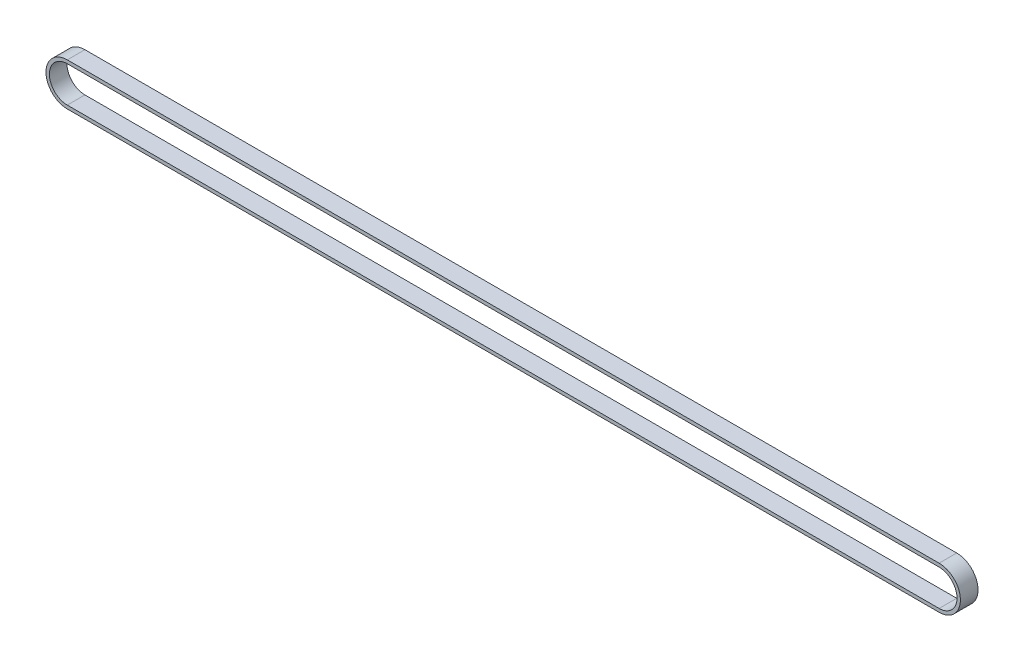
ISO-10303-21;
HEADER;
FILE_DESCRIPTION(('STEP AP214'),'2;1');
FILE_NAME('part.step','',(''),(''),'','','');
FILE_SCHEMA(('AUTOMOTIVE_DESIGN { 1 0 10303 214 1 1 1 1 }'));
ENDSEC;
DATA;
#1=APPLICATION_CONTEXT('core data for automotive mechanical design processes');
#2=APPLICATION_PROTOCOL_DEFINITION('international standard','automotive_design',2000,#1);
#3=PRODUCT_CONTEXT('',#1,'mechanical');
#4=PRODUCT('Part','Part','',(#3));
#5=PRODUCT_RELATED_PRODUCT_CATEGORY('part','',(#4));
#6=PRODUCT_DEFINITION_FORMATION('','',#4);
#7=PRODUCT_DEFINITION_CONTEXT('part definition',#1,'design');
#8=PRODUCT_DEFINITION('design','',#6,#7);
#9=PRODUCT_DEFINITION_SHAPE('','',#8);
#10=(LENGTH_UNIT() NAMED_UNIT(*) SI_UNIT(.MILLI.,.METRE.));
#11=(NAMED_UNIT(*) PLANE_ANGLE_UNIT() SI_UNIT($,.RADIAN.));
#12=(NAMED_UNIT(*) SI_UNIT($,.STERADIAN.) SOLID_ANGLE_UNIT());
#13=UNCERTAINTY_MEASURE_WITH_UNIT(LENGTH_MEASURE(1.E-05),#10,'distance_accuracy_value','');
#14=(GEOMETRIC_REPRESENTATION_CONTEXT(3) GLOBAL_UNCERTAINTY_ASSIGNED_CONTEXT((#13)) GLOBAL_UNIT_ASSIGNED_CONTEXT((#10,
#11,#12)) REPRESENTATION_CONTEXT('',''));
#15=CARTESIAN_POINT('',(0.,0.,0.));
#16=DIRECTION('',(0.,0.,1.));
#17=DIRECTION('',(1.,0.,0.));
#18=AXIS2_PLACEMENT_3D('',#15,#16,#17);
#19=CARTESIAN_POINT('',(0.,0.,3.));
#20=DIRECTION('',(0.,0.,1.));
#21=DIRECTION('',(1.,0.,0.));
#22=AXIS2_PLACEMENT_3D('',#19,#20,#21);
#23=PLANE('',#22);
#24=CARTESIAN_POINT('',(0.,0.,3.));
#25=DIRECTION('',(0.,0.,1.));
#26=DIRECTION('',(1.,0.,0.));
#27=AXIS2_PLACEMENT_3D('',#24,#25,#26);
#28=CIRCLE('',#27,7.25);
#29=CARTESIAN_POINT('',(0.,7.25,3.));
#30=VERTEX_POINT('',#29);
#31=CARTESIAN_POINT('',(0.,-7.25,3.));
#32=VERTEX_POINT('',#31);
#33=EDGE_CURVE('E119',#30,#32,#28,.T.);
#34=ORIENTED_EDGE('',*,*,#33,.T.);
#35=DIRECTION('',(1.,0.,0.));
#36=VECTOR('',#35,1.);
#37=CARTESIAN_POINT('',(0.,-7.25,3.));
#38=LINE('',#37,#36);
#39=CARTESIAN_POINT('',(297.,-7.25,3.));
#40=VERTEX_POINT('',#39);
#41=EDGE_CURVE('E122',#32,#40,#38,.T.);
#42=ORIENTED_EDGE('',*,*,#41,.T.);
#43=CARTESIAN_POINT('',(297.,0.,3.));
#44=DIRECTION('',(0.,0.,1.));
#45=DIRECTION('',(1.,0.,0.));
#46=AXIS2_PLACEMENT_3D('',#43,#44,#45);
#47=CIRCLE('',#46,7.25);
#48=CARTESIAN_POINT('',(297.,7.25,3.));
#49=VERTEX_POINT('',#48);
#50=EDGE_CURVE('E121',#40,#49,#47,.T.);
#51=ORIENTED_EDGE('',*,*,#50,.T.);
#52=DIRECTION('',(-1.,0.,0.));
#53=VECTOR('',#52,1.);
#54=CARTESIAN_POINT('',(0.,7.25,3.));
#55=LINE('',#54,#53);
#56=EDGE_CURVE('E130',#49,#30,#55,.T.);
#57=ORIENTED_EDGE('',*,*,#56,.T.);
#58=EDGE_LOOP('',(#34,#42,#51,#57));
#59=FACE_BOUND('',#58,.T.);
#60=DIRECTION('',(1.,0.,0.));
#61=VECTOR('',#60,1.);
#62=CARTESIAN_POINT('',(0.,-6.1,3.));
#63=LINE('',#62,#61);
#64=CARTESIAN_POINT('',(0.,-6.1,3.));
#65=VERTEX_POINT('',#64);
#66=CARTESIAN_POINT('',(297.,-6.1,3.));
#67=VERTEX_POINT('',#66);
#68=EDGE_CURVE('E89',#65,#67,#63,.T.);
#69=ORIENTED_EDGE('',*,*,#68,.F.);
#70=CARTESIAN_POINT('',(0.,0.,3.));
#71=DIRECTION('',(0.,0.,1.));
#72=DIRECTION('',(1.,0.,0.));
#73=AXIS2_PLACEMENT_3D('',#70,#71,#72);
#74=CIRCLE('',#73,6.1);
#75=CARTESIAN_POINT('',(0.,6.1,3.));
#76=VERTEX_POINT('',#75);
#77=EDGE_CURVE('E85',#76,#65,#74,.T.);
#78=ORIENTED_EDGE('',*,*,#77,.F.);
#79=DIRECTION('',(-1.,0.,0.));
#80=VECTOR('',#79,1.);
#81=CARTESIAN_POINT('',(0.,6.1,3.));
#82=LINE('',#81,#80);
#83=CARTESIAN_POINT('',(297.,6.1,3.));
#84=VERTEX_POINT('',#83);
#85=EDGE_CURVE('E102',#84,#76,#82,.T.);
#86=ORIENTED_EDGE('',*,*,#85,.F.);
#87=CARTESIAN_POINT('',(297.,0.,3.));
#88=DIRECTION('',(0.,0.,1.));
#89=DIRECTION('',(1.,0.,0.));
#90=AXIS2_PLACEMENT_3D('',#87,#88,#89);
#91=CIRCLE('',#90,6.1);
#92=EDGE_CURVE('E105',#67,#84,#91,.T.);
#93=ORIENTED_EDGE('',*,*,#92,.F.);
#94=EDGE_LOOP('',(#69,#78,#86,#93));
#95=FACE_BOUND('',#94,.T.);
#96=ADVANCED_FACE('F17',(#59,#95),#23,.T.);
#97=CARTESIAN_POINT('',(0.,0.,-3.));
#98=DIRECTION('',(0.,0.,1.));
#99=DIRECTION('',(1.,0.,0.));
#100=AXIS2_PLACEMENT_3D('',#97,#98,#99);
#101=PLANE('',#100);
#102=CARTESIAN_POINT('',(0.,0.,-3.));
#103=DIRECTION('',(0.,0.,1.));
#104=DIRECTION('',(1.,0.,0.));
#105=AXIS2_PLACEMENT_3D('',#102,#103,#104);
#106=CIRCLE('',#105,7.25);
#107=CARTESIAN_POINT('',(0.,7.25,-3.));
#108=VERTEX_POINT('',#107);
#109=CARTESIAN_POINT('',(0.,-7.25,-3.));
#110=VERTEX_POINT('',#109);
#111=EDGE_CURVE('E98',#108,#110,#106,.T.);
#112=ORIENTED_EDGE('',*,*,#111,.F.);
#113=DIRECTION('',(-1.,0.,0.));
#114=VECTOR('',#113,1.);
#115=CARTESIAN_POINT('',(0.,7.25,-3.));
#116=LINE('',#115,#114);
#117=CARTESIAN_POINT('',(297.,7.25,-3.));
#118=VERTEX_POINT('',#117);
#119=EDGE_CURVE('E125',#118,#108,#116,.T.);
#120=ORIENTED_EDGE('',*,*,#119,.F.);
#121=CARTESIAN_POINT('',(297.,0.,-3.));
#122=DIRECTION('',(0.,0.,1.));
#123=DIRECTION('',(1.,0.,0.));
#124=AXIS2_PLACEMENT_3D('',#121,#122,#123);
#125=CIRCLE('',#124,7.25);
#126=CARTESIAN_POINT('',(297.,-7.25,-3.));
#127=VERTEX_POINT('',#126);
#128=EDGE_CURVE('E132',#127,#118,#125,.T.);
#129=ORIENTED_EDGE('',*,*,#128,.F.);
#130=DIRECTION('',(1.,0.,0.));
#131=VECTOR('',#130,1.);
#132=CARTESIAN_POINT('',(0.,-7.25,-3.));
#133=LINE('',#132,#131);
#134=EDGE_CURVE('E131',#110,#127,#133,.T.);
#135=ORIENTED_EDGE('',*,*,#134,.F.);
#136=EDGE_LOOP('',(#112,#120,#129,#135));
#137=FACE_BOUND('',#136,.T.);
#138=CARTESIAN_POINT('',(0.,0.,-3.));
#139=DIRECTION('',(0.,0.,1.));
#140=DIRECTION('',(1.,0.,0.));
#141=AXIS2_PLACEMENT_3D('',#138,#139,#140);
#142=CIRCLE('',#141,6.1);
#143=CARTESIAN_POINT('',(0.,6.1,-3.));
#144=VERTEX_POINT('',#143);
#145=CARTESIAN_POINT('',(0.,-6.1,-3.));
#146=VERTEX_POINT('',#145);
#147=EDGE_CURVE('E37',#144,#146,#142,.T.);
#148=ORIENTED_EDGE('',*,*,#147,.T.);
#149=DIRECTION('',(1.,0.,0.));
#150=VECTOR('',#149,1.);
#151=CARTESIAN_POINT('',(0.,-6.1,-3.));
#152=LINE('',#151,#150);
#153=CARTESIAN_POINT('',(297.,-6.1,-3.));
#154=VERTEX_POINT('',#153);
#155=EDGE_CURVE('E100',#146,#154,#152,.T.);
#156=ORIENTED_EDGE('',*,*,#155,.T.);
#157=CARTESIAN_POINT('',(297.,0.,-3.));
#158=DIRECTION('',(0.,0.,1.));
#159=DIRECTION('',(1.,0.,0.));
#160=AXIS2_PLACEMENT_3D('',#157,#158,#159);
#161=CIRCLE('',#160,6.1);
#162=CARTESIAN_POINT('',(297.,6.1,-3.));
#163=VERTEX_POINT('',#162);
#164=EDGE_CURVE('E109',#154,#163,#161,.T.);
#165=ORIENTED_EDGE('',*,*,#164,.T.);
#166=DIRECTION('',(-1.,0.,0.));
#167=VECTOR('',#166,1.);
#168=CARTESIAN_POINT('',(0.,6.1,-3.));
#169=LINE('',#168,#167);
#170=EDGE_CURVE('E93',#163,#144,#169,.T.);
#171=ORIENTED_EDGE('',*,*,#170,.T.);
#172=EDGE_LOOP('',(#148,#156,#165,#171));
#173=FACE_BOUND('',#172,.T.);
#174=ADVANCED_FACE('F151',(#137,#173),#101,.F.);
#175=CARTESIAN_POINT('',(0.,0.,3.));
#176=DIRECTION('',(0.,0.,-1.));
#177=DIRECTION('',(-1.,0.,0.));
#178=AXIS2_PLACEMENT_3D('',#175,#176,#177);
#179=CYLINDRICAL_SURFACE('',#178,7.25);
#180=ORIENTED_EDGE('',*,*,#111,.T.);
#181=DIRECTION('',(0.,0.,-1.));
#182=VECTOR('',#181,1.);
#183=CARTESIAN_POINT('',(0.,-7.25,3.));
#184=LINE('',#183,#182);
#185=EDGE_CURVE('E11',#32,#110,#184,.T.);
#186=ORIENTED_EDGE('',*,*,#185,.F.);
#187=ORIENTED_EDGE('',*,*,#33,.F.);
#188=DIRECTION('',(0.,0.,-1.));
#189=VECTOR('',#188,1.);
#190=CARTESIAN_POINT('',(0.,7.25,3.));
#191=LINE('',#190,#189);
#192=EDGE_CURVE('E128',#30,#108,#191,.T.);
#193=ORIENTED_EDGE('',*,*,#192,.T.);
#194=EDGE_LOOP('',(#180,#186,#187,#193));
#195=FACE_BOUND('',#194,.T.);
#196=ADVANCED_FACE('F19',(#195),#179,.T.);
#197=CARTESIAN_POINT('',(0.,-7.25,3.));
#198=DIRECTION('',(0.,1.,0.));
#199=DIRECTION('',(0.,0.,1.));
#200=AXIS2_PLACEMENT_3D('',#197,#198,#199);
#201=PLANE('',#200);
#202=ORIENTED_EDGE('',*,*,#134,.T.);
#203=DIRECTION('',(0.,0.,-1.));
#204=VECTOR('',#203,1.);
#205=CARTESIAN_POINT('',(297.,-7.25,3.));
#206=LINE('',#205,#204);
#207=EDGE_CURVE('E25',#40,#127,#206,.T.);
#208=ORIENTED_EDGE('',*,*,#207,.F.);
#209=ORIENTED_EDGE('',*,*,#41,.F.);
#210=ORIENTED_EDGE('',*,*,#185,.T.);
#211=EDGE_LOOP('',(#202,#208,#209,#210));
#212=FACE_BOUND('',#211,.T.);
#213=ADVANCED_FACE('F161',(#212),#201,.F.);
#214=CARTESIAN_POINT('',(297.,0.,3.));
#215=DIRECTION('',(0.,0.,-1.));
#216=DIRECTION('',(-1.,0.,0.));
#217=AXIS2_PLACEMENT_3D('',#214,#215,#216);
#218=CYLINDRICAL_SURFACE('',#217,7.25);
#219=ORIENTED_EDGE('',*,*,#128,.T.);
#220=DIRECTION('',(0.,0.,-1.));
#221=VECTOR('',#220,1.);
#222=CARTESIAN_POINT('',(297.,7.25,3.));
#223=LINE('',#222,#221);
#224=EDGE_CURVE('E138',#49,#118,#223,.T.);
#225=ORIENTED_EDGE('',*,*,#224,.F.);
#226=ORIENTED_EDGE('',*,*,#50,.F.);
#227=ORIENTED_EDGE('',*,*,#207,.T.);
#228=EDGE_LOOP('',(#219,#225,#226,#227));
#229=FACE_BOUND('',#228,.T.);
#230=ADVANCED_FACE('F144',(#229),#218,.T.);
#231=CARTESIAN_POINT('',(0.,7.25,3.));
#232=DIRECTION('',(0.,-1.,0.));
#233=DIRECTION('',(0.,0.,-1.));
#234=AXIS2_PLACEMENT_3D('',#231,#232,#233);
#235=PLANE('',#234);
#236=ORIENTED_EDGE('',*,*,#119,.T.);
#237=ORIENTED_EDGE('',*,*,#192,.F.);
#238=ORIENTED_EDGE('',*,*,#56,.F.);
#239=ORIENTED_EDGE('',*,*,#224,.T.);
#240=EDGE_LOOP('',(#236,#237,#238,#239));
#241=FACE_BOUND('',#240,.T.);
#242=ADVANCED_FACE('F154',(#241),#235,.F.);
#243=CARTESIAN_POINT('',(0.,0.,3.));
#244=DIRECTION('',(0.,0.,-1.));
#245=DIRECTION('',(-1.,0.,0.));
#246=AXIS2_PLACEMENT_3D('',#243,#244,#245);
#247=CYLINDRICAL_SURFACE('',#246,6.1);
#248=ORIENTED_EDGE('',*,*,#147,.F.);
#249=DIRECTION('',(0.,0.,-1.));
#250=VECTOR('',#249,1.);
#251=CARTESIAN_POINT('',(0.,6.1,3.));
#252=LINE('',#251,#250);
#253=EDGE_CURVE('E88',#76,#144,#252,.T.);
#254=ORIENTED_EDGE('',*,*,#253,.F.);
#255=ORIENTED_EDGE('',*,*,#77,.T.);
#256=DIRECTION('',(0.,0.,-1.));
#257=VECTOR('',#256,1.);
#258=CARTESIAN_POINT('',(0.,-6.1,3.));
#259=LINE('',#258,#257);
#260=EDGE_CURVE('E84',#65,#146,#259,.T.);
#261=ORIENTED_EDGE('',*,*,#260,.T.);
#262=EDGE_LOOP('',(#248,#254,#255,#261));
#263=FACE_BOUND('',#262,.T.);
#264=ADVANCED_FACE('F82',(#263),#247,.F.);
#265=CARTESIAN_POINT('',(0.,-6.1,3.));
#266=DIRECTION('',(0.,1.,0.));
#267=DIRECTION('',(0.,0.,1.));
#268=AXIS2_PLACEMENT_3D('',#265,#266,#267);
#269=PLANE('',#268);
#270=ORIENTED_EDGE('',*,*,#155,.F.);
#271=ORIENTED_EDGE('',*,*,#260,.F.);
#272=ORIENTED_EDGE('',*,*,#68,.T.);
#273=DIRECTION('',(0.,0.,-1.));
#274=VECTOR('',#273,1.);
#275=CARTESIAN_POINT('',(297.,-6.1,3.));
#276=LINE('',#275,#274);
#277=EDGE_CURVE('E97',#67,#154,#276,.T.);
#278=ORIENTED_EDGE('',*,*,#277,.T.);
#279=EDGE_LOOP('',(#270,#271,#272,#278));
#280=FACE_BOUND('',#279,.T.);
#281=ADVANCED_FACE('F94',(#280),#269,.T.);
#282=CARTESIAN_POINT('',(297.,0.,3.));
#283=DIRECTION('',(0.,0.,-1.));
#284=DIRECTION('',(-1.,0.,0.));
#285=AXIS2_PLACEMENT_3D('',#282,#283,#284);
#286=CYLINDRICAL_SURFACE('',#285,6.1);
#287=ORIENTED_EDGE('',*,*,#164,.F.);
#288=ORIENTED_EDGE('',*,*,#277,.F.);
#289=ORIENTED_EDGE('',*,*,#92,.T.);
#290=DIRECTION('',(0.,0.,-1.));
#291=VECTOR('',#290,1.);
#292=CARTESIAN_POINT('',(297.,6.1,3.));
#293=LINE('',#292,#291);
#294=EDGE_CURVE('E32',#84,#163,#293,.T.);
#295=ORIENTED_EDGE('',*,*,#294,.T.);
#296=EDGE_LOOP('',(#287,#288,#289,#295));
#297=FACE_BOUND('',#296,.T.);
#298=ADVANCED_FACE('F188',(#297),#286,.F.);
#299=CARTESIAN_POINT('',(0.,6.1,3.));
#300=DIRECTION('',(0.,-1.,0.));
#301=DIRECTION('',(0.,0.,-1.));
#302=AXIS2_PLACEMENT_3D('',#299,#300,#301);
#303=PLANE('',#302);
#304=ORIENTED_EDGE('',*,*,#170,.F.);
#305=ORIENTED_EDGE('',*,*,#294,.F.);
#306=ORIENTED_EDGE('',*,*,#85,.T.);
#307=ORIENTED_EDGE('',*,*,#253,.T.);
#308=EDGE_LOOP('',(#304,#305,#306,#307));
#309=FACE_BOUND('',#308,.T.);
#310=ADVANCED_FACE('F192',(#309),#303,.T.);
#311=CLOSED_SHELL('',(#96,#174,#196,#213,#230,#242,#264,#281,#298,#310));
#312=MANIFOLD_SOLID_BREP('B1',#311);
#313=ADVANCED_BREP_SHAPE_REPRESENTATION('',(#18,#312),#14);
#314=SHAPE_DEFINITION_REPRESENTATION(#9,#313);
ENDSEC;
END-ISO-10303-21;
